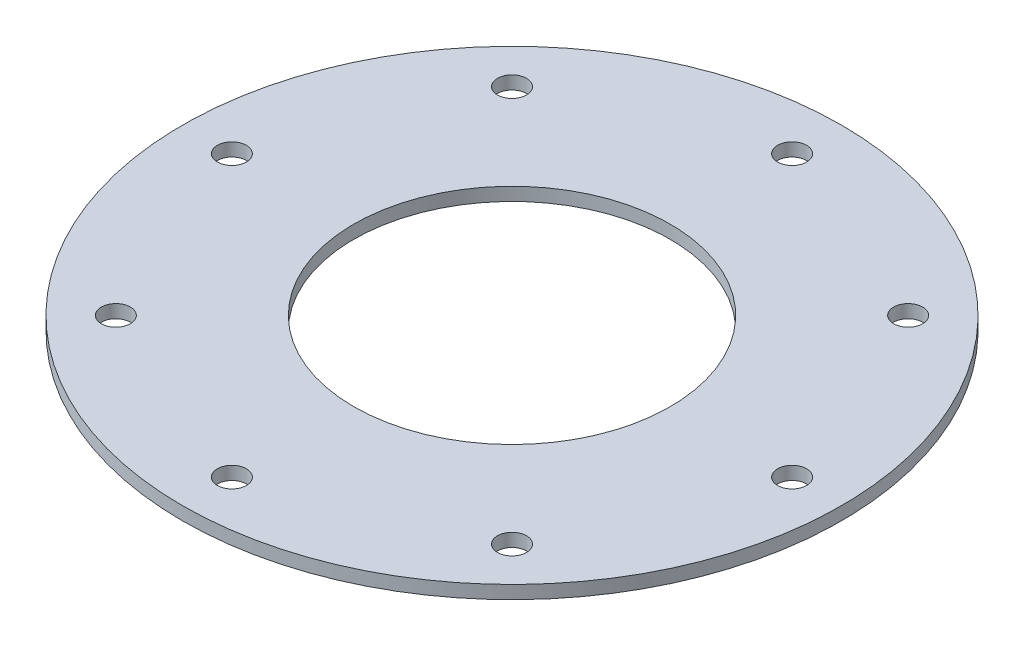
ISO-10303-21;
HEADER;
FILE_DESCRIPTION(('STEP AP214'),'2;1');
FILE_NAME('part.step','',(''),(''),'','','');
FILE_SCHEMA(('AUTOMOTIVE_DESIGN { 1 0 10303 214 1 1 1 1 }'));
ENDSEC;
DATA;
#1=APPLICATION_CONTEXT('core data for automotive mechanical design processes');
#2=APPLICATION_PROTOCOL_DEFINITION('international standard','automotive_design',2000,#1);
#3=PRODUCT_CONTEXT('',#1,'mechanical');
#4=PRODUCT('Part','Part','',(#3));
#5=PRODUCT_RELATED_PRODUCT_CATEGORY('part','',(#4));
#6=PRODUCT_DEFINITION_FORMATION('','',#4);
#7=PRODUCT_DEFINITION_CONTEXT('part definition',#1,'design');
#8=PRODUCT_DEFINITION('design','',#6,#7);
#9=PRODUCT_DEFINITION_SHAPE('','',#8);
#10=(LENGTH_UNIT() NAMED_UNIT(*) SI_UNIT(.MILLI.,.METRE.));
#11=(NAMED_UNIT(*) PLANE_ANGLE_UNIT() SI_UNIT($,.RADIAN.));
#12=(NAMED_UNIT(*) SI_UNIT($,.STERADIAN.) SOLID_ANGLE_UNIT());
#13=UNCERTAINTY_MEASURE_WITH_UNIT(LENGTH_MEASURE(1.E-05),#10,'distance_accuracy_value','');
#14=(GEOMETRIC_REPRESENTATION_CONTEXT(3) GLOBAL_UNCERTAINTY_ASSIGNED_CONTEXT((#13)) GLOBAL_UNIT_ASSIGNED_CONTEXT((#10,
#11,#12)) REPRESENTATION_CONTEXT('',''));
#15=CARTESIAN_POINT('',(0.,0.,0.));
#16=DIRECTION('',(0.,0.,1.));
#17=DIRECTION('',(1.,0.,0.));
#18=AXIS2_PLACEMENT_3D('',#15,#16,#17);
#19=CARTESIAN_POINT('',(0.,4.,0.));
#20=DIRECTION('',(0.,1.,0.));
#21=DIRECTION('',(0.,0.,1.));
#22=AXIS2_PLACEMENT_3D('',#19,#20,#21);
#23=PLANE('',#22);
#24=CARTESIAN_POINT('',(0.,4.,-85.));
#25=DIRECTION('',(0.,1.,0.));
#26=DIRECTION('',(0.,0.,1.));
#27=AXIS2_PLACEMENT_3D('',#24,#25,#26);
#28=CIRCLE('',#27,4.4);
#29=CARTESIAN_POINT('',(0.,4.,-80.6));
#30=VERTEX_POINT('',#29);
#31=EDGE_CURVE('E92',#30,#30,#28,.T.);
#32=ORIENTED_EDGE('',*,*,#31,.F.);
#33=EDGE_LOOP('',(#32));
#34=FACE_BOUND('',#33,.T.);
#35=CARTESIAN_POINT('',(-85.,4.,0.));
#36=DIRECTION('',(0.,1.,0.));
#37=DIRECTION('',(0.,0.,1.));
#38=AXIS2_PLACEMENT_3D('',#35,#36,#37);
#39=CIRCLE('',#38,4.4);
#40=CARTESIAN_POINT('',(-85.,4.,4.39999999999999));
#41=VERTEX_POINT('',#40);
#42=EDGE_CURVE('E79',#41,#41,#39,.T.);
#43=ORIENTED_EDGE('',*,*,#42,.F.);
#44=EDGE_LOOP('',(#43));
#45=FACE_BOUND('',#44,.T.);
#46=CARTESIAN_POINT('',(0.,4.,85.));
#47=DIRECTION('',(0.,1.,0.));
#48=DIRECTION('',(0.,0.,1.));
#49=AXIS2_PLACEMENT_3D('',#46,#47,#48);
#50=CIRCLE('',#49,4.4);
#51=CARTESIAN_POINT('',(0.,4.,89.4));
#52=VERTEX_POINT('',#51);
#53=EDGE_CURVE('E66',#52,#52,#50,.T.);
#54=ORIENTED_EDGE('',*,*,#53,.F.);
#55=EDGE_LOOP('',(#54));
#56=FACE_BOUND('',#55,.T.);
#57=CARTESIAN_POINT('',(85.,4.,0.));
#58=DIRECTION('',(0.,1.,0.));
#59=DIRECTION('',(0.,0.,1.));
#60=AXIS2_PLACEMENT_3D('',#57,#58,#59);
#61=CIRCLE('',#60,4.4);
#62=CARTESIAN_POINT('',(85.,4.,4.4));
#63=VERTEX_POINT('',#62);
#64=EDGE_CURVE('E54',#63,#63,#61,.T.);
#65=ORIENTED_EDGE('',*,*,#64,.F.);
#66=EDGE_LOOP('',(#65));
#67=FACE_BOUND('',#66,.T.);
#68=CARTESIAN_POINT('',(0.,4.,0.));
#69=DIRECTION('',(0.,1.,0.));
#70=DIRECTION('',(0.,0.,1.));
#71=AXIS2_PLACEMENT_3D('',#68,#69,#70);
#72=CIRCLE('',#71,100.);
#73=CARTESIAN_POINT('',(0.,4.,100.));
#74=VERTEX_POINT('',#73);
#75=EDGE_CURVE('E10',#74,#74,#72,.T.);
#76=ORIENTED_EDGE('',*,*,#75,.T.);
#77=EDGE_LOOP('',(#76));
#78=FACE_BOUND('',#77,.T.);
#79=CARTESIAN_POINT('',(0.,4.,0.));
#80=DIRECTION('',(0.,1.,0.));
#81=DIRECTION('',(0.,0.,1.));
#82=AXIS2_PLACEMENT_3D('',#79,#80,#81);
#83=CIRCLE('',#82,48.);
#84=CARTESIAN_POINT('',(0.,4.,48.));
#85=VERTEX_POINT('',#84);
#86=EDGE_CURVE('E49',#85,#85,#83,.T.);
#87=ORIENTED_EDGE('',*,*,#86,.F.);
#88=EDGE_LOOP('',(#87));
#89=FACE_BOUND('',#88,.T.);
#90=CARTESIAN_POINT('',(60.1040764008565,4.,60.1040764008565));
#91=DIRECTION('',(0.,1.,0.));
#92=DIRECTION('',(0.,0.,1.));
#93=AXIS2_PLACEMENT_3D('',#90,#91,#92);
#94=CIRCLE('',#93,4.39999999999999);
#95=CARTESIAN_POINT('',(60.1040764008565,4.,64.5040764008565));
#96=VERTEX_POINT('',#95);
#97=EDGE_CURVE('E64',#96,#96,#94,.T.);
#98=ORIENTED_EDGE('',*,*,#97,.F.);
#99=EDGE_LOOP('',(#98));
#100=FACE_BOUND('',#99,.T.);
#101=CARTESIAN_POINT('',(-60.1040764008565,4.,60.1040764008565));
#102=DIRECTION('',(0.,1.,0.));
#103=DIRECTION('',(0.,0.,1.));
#104=AXIS2_PLACEMENT_3D('',#101,#102,#103);
#105=CIRCLE('',#104,4.4);
#106=CARTESIAN_POINT('',(-60.1040764008565,4.,64.5040764008565));
#107=VERTEX_POINT('',#106);
#108=EDGE_CURVE('E74',#107,#107,#105,.T.);
#109=ORIENTED_EDGE('',*,*,#108,.F.);
#110=EDGE_LOOP('',(#109));
#111=FACE_BOUND('',#110,.T.);
#112=CARTESIAN_POINT('',(-60.1040764008566,4.,-60.1040764008566));
#113=DIRECTION('',(0.,1.,0.));
#114=DIRECTION('',(0.,0.,1.));
#115=AXIS2_PLACEMENT_3D('',#112,#113,#114);
#116=CIRCLE('',#115,4.4);
#117=CARTESIAN_POINT('',(-60.1040764008566,4.,-55.7040764008566));
#118=VERTEX_POINT('',#117);
#119=EDGE_CURVE('E82',#118,#118,#116,.T.);
#120=ORIENTED_EDGE('',*,*,#119,.F.);
#121=EDGE_LOOP('',(#120));
#122=FACE_BOUND('',#121,.T.);
#123=CARTESIAN_POINT('',(60.1040764008565,4.,-60.1040764008566));
#124=DIRECTION('',(0.,1.,0.));
#125=DIRECTION('',(0.,0.,1.));
#126=AXIS2_PLACEMENT_3D('',#123,#124,#125);
#127=CIRCLE('',#126,4.4);
#128=CARTESIAN_POINT('',(60.1040764008565,4.,-55.7040764008566));
#129=VERTEX_POINT('',#128);
#130=EDGE_CURVE('E97',#129,#129,#127,.T.);
#131=ORIENTED_EDGE('',*,*,#130,.F.);
#132=EDGE_LOOP('',(#131));
#133=FACE_BOUND('',#132,.T.);
#134=ADVANCED_FACE('F39',(#34,#45,#56,#67,#78,#89,#100,#111,#122,#133),#23,.T.);
#135=CARTESIAN_POINT('',(0.,0.,0.));
#136=DIRECTION('',(0.,1.,0.));
#137=DIRECTION('',(0.,0.,1.));
#138=AXIS2_PLACEMENT_3D('',#135,#136,#137);
#139=PLANE('',#138);
#140=CARTESIAN_POINT('',(0.,0.,0.));
#141=DIRECTION('',(0.,1.,0.));
#142=DIRECTION('',(0.,0.,1.));
#143=AXIS2_PLACEMENT_3D('',#140,#141,#142);
#144=CIRCLE('',#143,100.);
#145=CARTESIAN_POINT('',(0.,0.,100.));
#146=VERTEX_POINT('',#145);
#147=EDGE_CURVE('E43',#146,#146,#144,.T.);
#148=ORIENTED_EDGE('',*,*,#147,.F.);
#149=EDGE_LOOP('',(#148));
#150=FACE_BOUND('',#149,.T.);
#151=CARTESIAN_POINT('',(0.,0.,0.));
#152=DIRECTION('',(0.,1.,0.));
#153=DIRECTION('',(0.,0.,1.));
#154=AXIS2_PLACEMENT_3D('',#151,#152,#153);
#155=CIRCLE('',#154,48.);
#156=CARTESIAN_POINT('',(0.,0.,48.));
#157=VERTEX_POINT('',#156);
#158=EDGE_CURVE('E55',#157,#157,#155,.T.);
#159=ORIENTED_EDGE('',*,*,#158,.T.);
#160=EDGE_LOOP('',(#159));
#161=FACE_BOUND('',#160,.T.);
#162=CARTESIAN_POINT('',(85.,0.,0.));
#163=DIRECTION('',(0.,1.,0.));
#164=DIRECTION('',(0.,0.,1.));
#165=AXIS2_PLACEMENT_3D('',#162,#163,#164);
#166=CIRCLE('',#165,4.4);
#167=CARTESIAN_POINT('',(85.,0.,4.4));
#168=VERTEX_POINT('',#167);
#169=EDGE_CURVE('E59',#168,#168,#166,.T.);
#170=ORIENTED_EDGE('',*,*,#169,.T.);
#171=EDGE_LOOP('',(#170));
#172=FACE_BOUND('',#171,.T.);
#173=CARTESIAN_POINT('',(60.1040764008565,0.,60.1040764008565));
#174=DIRECTION('',(0.,1.,0.));
#175=DIRECTION('',(0.,0.,1.));
#176=AXIS2_PLACEMENT_3D('',#173,#174,#175);
#177=CIRCLE('',#176,4.39999999999999);
#178=CARTESIAN_POINT('',(60.1040764008565,0.,64.5040764008565));
#179=VERTEX_POINT('',#178);
#180=EDGE_CURVE('E63',#179,#179,#177,.T.);
#181=ORIENTED_EDGE('',*,*,#180,.T.);
#182=EDGE_LOOP('',(#181));
#183=FACE_BOUND('',#182,.T.);
#184=CARTESIAN_POINT('',(0.,0.,85.));
#185=DIRECTION('',(0.,1.,0.));
#186=DIRECTION('',(0.,0.,1.));
#187=AXIS2_PLACEMENT_3D('',#184,#185,#186);
#188=CIRCLE('',#187,4.4);
#189=CARTESIAN_POINT('',(0.,0.,89.4));
#190=VERTEX_POINT('',#189);
#191=EDGE_CURVE('E67',#190,#190,#188,.T.);
#192=ORIENTED_EDGE('',*,*,#191,.T.);
#193=EDGE_LOOP('',(#192));
#194=FACE_BOUND('',#193,.T.);
#195=CARTESIAN_POINT('',(-60.1040764008565,0.,60.1040764008565));
#196=DIRECTION('',(0.,1.,0.));
#197=DIRECTION('',(0.,0.,1.));
#198=AXIS2_PLACEMENT_3D('',#195,#196,#197);
#199=CIRCLE('',#198,4.4);
#200=CARTESIAN_POINT('',(-60.1040764008565,0.,64.5040764008565));
#201=VERTEX_POINT('',#200);
#202=EDGE_CURVE('E77',#201,#201,#199,.T.);
#203=ORIENTED_EDGE('',*,*,#202,.T.);
#204=EDGE_LOOP('',(#203));
#205=FACE_BOUND('',#204,.T.);
#206=CARTESIAN_POINT('',(-85.,0.,0.));
#207=DIRECTION('',(0.,1.,0.));
#208=DIRECTION('',(0.,0.,1.));
#209=AXIS2_PLACEMENT_3D('',#206,#207,#208);
#210=CIRCLE('',#209,4.4);
#211=CARTESIAN_POINT('',(-85.,0.,4.39999999999999));
#212=VERTEX_POINT('',#211);
#213=EDGE_CURVE('E81',#212,#212,#210,.T.);
#214=ORIENTED_EDGE('',*,*,#213,.T.);
#215=EDGE_LOOP('',(#214));
#216=FACE_BOUND('',#215,.T.);
#217=CARTESIAN_POINT('',(-60.1040764008566,0.,-60.1040764008566));
#218=DIRECTION('',(0.,1.,0.));
#219=DIRECTION('',(0.,0.,1.));
#220=AXIS2_PLACEMENT_3D('',#217,#218,#219);
#221=CIRCLE('',#220,4.4);
#222=CARTESIAN_POINT('',(-60.1040764008566,0.,-55.7040764008566));
#223=VERTEX_POINT('',#222);
#224=EDGE_CURVE('E90',#223,#223,#221,.T.);
#225=ORIENTED_EDGE('',*,*,#224,.T.);
#226=EDGE_LOOP('',(#225));
#227=FACE_BOUND('',#226,.T.);
#228=CARTESIAN_POINT('',(0.,0.,-85.));
#229=DIRECTION('',(0.,1.,0.));
#230=DIRECTION('',(0.,0.,1.));
#231=AXIS2_PLACEMENT_3D('',#228,#229,#230);
#232=CIRCLE('',#231,4.4);
#233=CARTESIAN_POINT('',(0.,0.,-80.6));
#234=VERTEX_POINT('',#233);
#235=EDGE_CURVE('E91',#234,#234,#232,.T.);
#236=ORIENTED_EDGE('',*,*,#235,.T.);
#237=EDGE_LOOP('',(#236));
#238=FACE_BOUND('',#237,.T.);
#239=CARTESIAN_POINT('',(60.1040764008565,0.,-60.1040764008566));
#240=DIRECTION('',(0.,1.,0.));
#241=DIRECTION('',(0.,0.,1.));
#242=AXIS2_PLACEMENT_3D('',#239,#240,#241);
#243=CIRCLE('',#242,4.4);
#244=CARTESIAN_POINT('',(60.1040764008565,0.,-55.7040764008566));
#245=VERTEX_POINT('',#244);
#246=EDGE_CURVE('E99',#245,#245,#243,.T.);
#247=ORIENTED_EDGE('',*,*,#246,.T.);
#248=EDGE_LOOP('',(#247));
#249=FACE_BOUND('',#248,.T.);
#250=ADVANCED_FACE('F109',(#150,#161,#172,#183,#194,#205,#216,#227,#238,#249),#139,.F.);
#251=CARTESIAN_POINT('',(0.,4.,0.));
#252=DIRECTION('',(0.,-1.,0.));
#253=DIRECTION('',(0.,0.,-1.));
#254=AXIS2_PLACEMENT_3D('',#251,#252,#253);
#255=CYLINDRICAL_SURFACE('',#254,100.);
#256=ORIENTED_EDGE('',*,*,#75,.F.);
#257=EDGE_LOOP('',(#256));
#258=FACE_BOUND('',#257,.T.);
#259=ORIENTED_EDGE('',*,*,#147,.T.);
#260=EDGE_LOOP('',(#259));
#261=FACE_BOUND('',#260,.T.);
#262=ADVANCED_FACE('F41',(#258,#261),#255,.T.);
#263=CARTESIAN_POINT('',(0.,4.,0.));
#264=DIRECTION('',(0.,-1.,0.));
#265=DIRECTION('',(0.,0.,-1.));
#266=AXIS2_PLACEMENT_3D('',#263,#264,#265);
#267=CYLINDRICAL_SURFACE('',#266,48.);
#268=ORIENTED_EDGE('',*,*,#86,.T.);
#269=EDGE_LOOP('',(#268));
#270=FACE_BOUND('',#269,.T.);
#271=ORIENTED_EDGE('',*,*,#158,.F.);
#272=EDGE_LOOP('',(#271));
#273=FACE_BOUND('',#272,.T.);
#274=ADVANCED_FACE('F119',(#270,#273),#267,.F.);
#275=CARTESIAN_POINT('',(85.,4.,0.));
#276=DIRECTION('',(0.,-1.,0.));
#277=DIRECTION('',(0.,0.,-1.));
#278=AXIS2_PLACEMENT_3D('',#275,#276,#277);
#279=CYLINDRICAL_SURFACE('',#278,4.4);
#280=ORIENTED_EDGE('',*,*,#64,.T.);
#281=EDGE_LOOP('',(#280));
#282=FACE_BOUND('',#281,.T.);
#283=ORIENTED_EDGE('',*,*,#169,.F.);
#284=EDGE_LOOP('',(#283));
#285=FACE_BOUND('',#284,.T.);
#286=ADVANCED_FACE('F124',(#282,#285),#279,.F.);
#287=CARTESIAN_POINT('',(60.1040764008565,4.,60.1040764008565));
#288=DIRECTION('',(0.,-1.,0.));
#289=DIRECTION('',(0.,0.,-1.));
#290=AXIS2_PLACEMENT_3D('',#287,#288,#289);
#291=CYLINDRICAL_SURFACE('',#290,4.39999999999999);
#292=ORIENTED_EDGE('',*,*,#97,.T.);
#293=EDGE_LOOP('',(#292));
#294=FACE_BOUND('',#293,.T.);
#295=ORIENTED_EDGE('',*,*,#180,.F.);
#296=EDGE_LOOP('',(#295));
#297=FACE_BOUND('',#296,.T.);
#298=ADVANCED_FACE('F126',(#294,#297),#291,.F.);
#299=CARTESIAN_POINT('',(0.,4.,85.));
#300=DIRECTION('',(0.,-1.,0.));
#301=DIRECTION('',(0.,0.,-1.));
#302=AXIS2_PLACEMENT_3D('',#299,#300,#301);
#303=CYLINDRICAL_SURFACE('',#302,4.4);
#304=ORIENTED_EDGE('',*,*,#53,.T.);
#305=EDGE_LOOP('',(#304));
#306=FACE_BOUND('',#305,.T.);
#307=ORIENTED_EDGE('',*,*,#191,.F.);
#308=EDGE_LOOP('',(#307));
#309=FACE_BOUND('',#308,.T.);
#310=ADVANCED_FACE('F134',(#306,#309),#303,.F.);
#311=CARTESIAN_POINT('',(-60.1040764008565,4.,60.1040764008565));
#312=DIRECTION('',(0.,-1.,0.));
#313=DIRECTION('',(0.,0.,-1.));
#314=AXIS2_PLACEMENT_3D('',#311,#312,#313);
#315=CYLINDRICAL_SURFACE('',#314,4.4);
#316=ORIENTED_EDGE('',*,*,#108,.T.);
#317=EDGE_LOOP('',(#316));
#318=FACE_BOUND('',#317,.T.);
#319=ORIENTED_EDGE('',*,*,#202,.F.);
#320=EDGE_LOOP('',(#319));
#321=FACE_BOUND('',#320,.T.);
#322=ADVANCED_FACE('F132',(#318,#321),#315,.F.);
#323=CARTESIAN_POINT('',(-85.,4.,0.));
#324=DIRECTION('',(0.,-1.,0.));
#325=DIRECTION('',(0.,0.,-1.));
#326=AXIS2_PLACEMENT_3D('',#323,#324,#325);
#327=CYLINDRICAL_SURFACE('',#326,4.4);
#328=ORIENTED_EDGE('',*,*,#42,.T.);
#329=EDGE_LOOP('',(#328));
#330=FACE_BOUND('',#329,.T.);
#331=ORIENTED_EDGE('',*,*,#213,.F.);
#332=EDGE_LOOP('',(#331));
#333=FACE_BOUND('',#332,.T.);
#334=ADVANCED_FACE('F136',(#330,#333),#327,.F.);
#335=CARTESIAN_POINT('',(-60.1040764008566,4.,-60.1040764008566));
#336=DIRECTION('',(0.,-1.,0.));
#337=DIRECTION('',(0.,0.,-1.));
#338=AXIS2_PLACEMENT_3D('',#335,#336,#337);
#339=CYLINDRICAL_SURFACE('',#338,4.4);
#340=ORIENTED_EDGE('',*,*,#119,.T.);
#341=EDGE_LOOP('',(#340));
#342=FACE_BOUND('',#341,.T.);
#343=ORIENTED_EDGE('',*,*,#224,.F.);
#344=EDGE_LOOP('',(#343));
#345=FACE_BOUND('',#344,.T.);
#346=ADVANCED_FACE('F141',(#342,#345),#339,.F.);
#347=CARTESIAN_POINT('',(0.,4.,-85.));
#348=DIRECTION('',(0.,-1.,0.));
#349=DIRECTION('',(0.,0.,-1.));
#350=AXIS2_PLACEMENT_3D('',#347,#348,#349);
#351=CYLINDRICAL_SURFACE('',#350,4.4);
#352=ORIENTED_EDGE('',*,*,#31,.T.);
#353=EDGE_LOOP('',(#352));
#354=FACE_BOUND('',#353,.T.);
#355=ORIENTED_EDGE('',*,*,#235,.F.);
#356=EDGE_LOOP('',(#355));
#357=FACE_BOUND('',#356,.T.);
#358=ADVANCED_FACE('F146',(#354,#357),#351,.F.);
#359=CARTESIAN_POINT('',(60.1040764008565,4.,-60.1040764008566));
#360=DIRECTION('',(0.,-1.,0.));
#361=DIRECTION('',(0.,0.,-1.));
#362=AXIS2_PLACEMENT_3D('',#359,#360,#361);
#363=CYLINDRICAL_SURFACE('',#362,4.4);
#364=ORIENTED_EDGE('',*,*,#130,.T.);
#365=EDGE_LOOP('',(#364));
#366=FACE_BOUND('',#365,.T.);
#367=ORIENTED_EDGE('',*,*,#246,.F.);
#368=EDGE_LOOP('',(#367));
#369=FACE_BOUND('',#368,.T.);
#370=ADVANCED_FACE('F106',(#366,#369),#363,.F.);
#371=CLOSED_SHELL('',(#134,#250,#262,#274,#286,#298,#310,#322,#334,#346,#358,#370));
#372=MANIFOLD_SOLID_BREP('B2',#371);
#373=ADVANCED_BREP_SHAPE_REPRESENTATION('',(#18,#372),#14);
#374=SHAPE_DEFINITION_REPRESENTATION(#9,#373);
ENDSEC;
END-ISO-10303-21;
